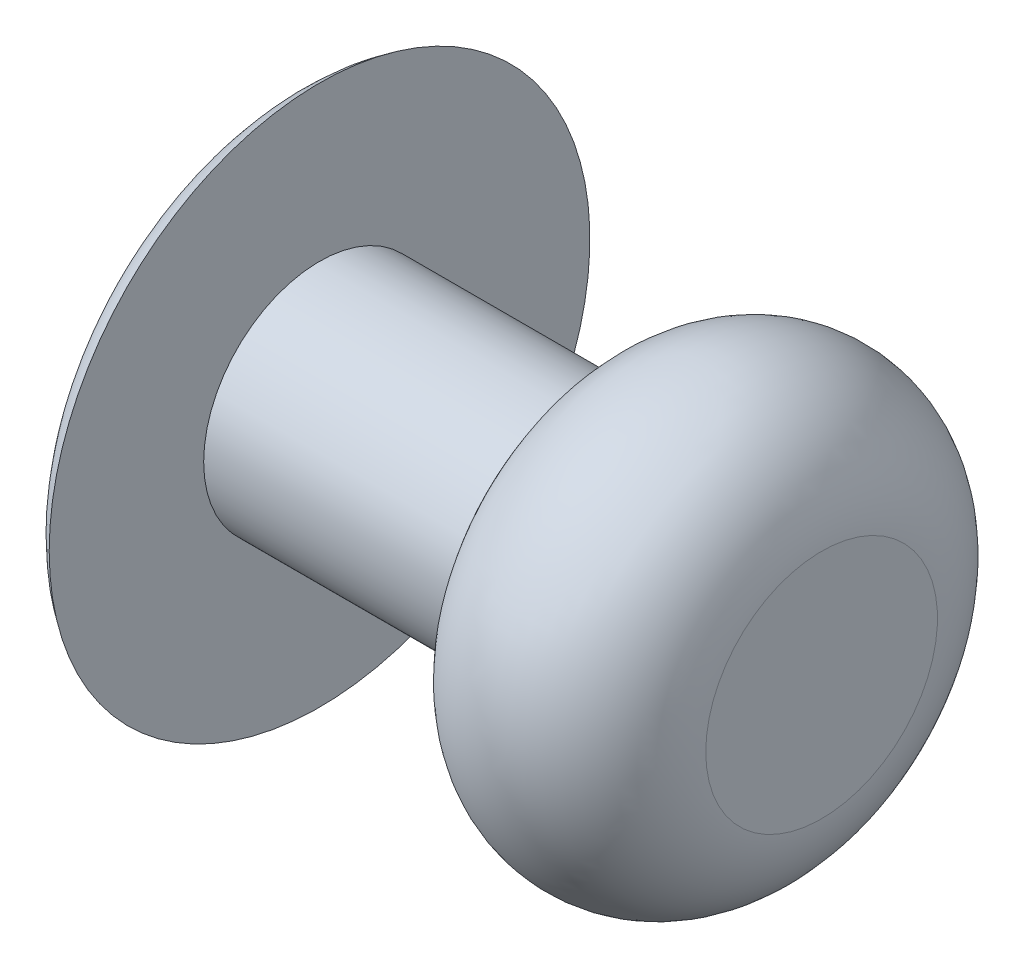
ISO-10303-21;
HEADER;
FILE_DESCRIPTION(('STEP AP214'),'2;1');
FILE_NAME('part.step','',(''),(''),'','','');
FILE_SCHEMA(('AUTOMOTIVE_DESIGN { 1 0 10303 214 1 1 1 1 }'));
ENDSEC;
DATA;
#1=APPLICATION_CONTEXT('core data for automotive mechanical design processes');
#2=APPLICATION_PROTOCOL_DEFINITION('international standard','automotive_design',2000,#1);
#3=PRODUCT_CONTEXT('',#1,'mechanical');
#4=PRODUCT('Part','Part','',(#3));
#5=PRODUCT_RELATED_PRODUCT_CATEGORY('part','',(#4));
#6=PRODUCT_DEFINITION_FORMATION('','',#4);
#7=PRODUCT_DEFINITION_CONTEXT('part definition',#1,'design');
#8=PRODUCT_DEFINITION('design','',#6,#7);
#9=PRODUCT_DEFINITION_SHAPE('','',#8);
#10=(LENGTH_UNIT() NAMED_UNIT(*) SI_UNIT(.MILLI.,.METRE.));
#11=(NAMED_UNIT(*) PLANE_ANGLE_UNIT() SI_UNIT($,.RADIAN.));
#12=(NAMED_UNIT(*) SI_UNIT($,.STERADIAN.) SOLID_ANGLE_UNIT());
#13=UNCERTAINTY_MEASURE_WITH_UNIT(LENGTH_MEASURE(1.E-05),#10,'distance_accuracy_value','');
#14=(GEOMETRIC_REPRESENTATION_CONTEXT(3) GLOBAL_UNCERTAINTY_ASSIGNED_CONTEXT((#13)) GLOBAL_UNIT_ASSIGNED_CONTEXT((#10,
#11,#12)) REPRESENTATION_CONTEXT('',''));
#15=CARTESIAN_POINT('',(0.,0.,0.));
#16=DIRECTION('',(0.,0.,1.));
#17=DIRECTION('',(1.,0.,0.));
#18=AXIS2_PLACEMENT_3D('',#15,#16,#17);
#19=CARTESIAN_POINT('',(-6.43890633447847,1.5,0.));
#20=DIRECTION('',(-1.,0.,0.));
#21=DIRECTION('',(0.,0.,1.));
#22=AXIS2_PLACEMENT_3D('',#19,#20,#21);
#23=PLANE('',#22);
#24=CARTESIAN_POINT('',(-6.43890633447848,0.,0.));
#25=DIRECTION('',(-1.,0.,0.));
#26=DIRECTION('',(0.,0.,1.));
#27=AXIS2_PLACEMENT_3D('',#24,#25,#26);
#28=CIRCLE('',#27,1.5);
#29=CARTESIAN_POINT('',(-6.43890633447848,0.,1.5));
#30=VERTEX_POINT('',#29);
#31=EDGE_CURVE('E10',#30,#30,#28,.T.);
#32=ORIENTED_EDGE('',*,*,#31,.F.);
#33=EDGE_LOOP('',(#32));
#34=FACE_BOUND('',#33,.T.);
#35=ADVANCED_FACE('F30',(#34),#23,.F.);
#36=CARTESIAN_POINT('',(-7.93890633447847,0.,0.));
#37=DIRECTION('',(-1.,0.,0.));
#38=DIRECTION('',(0.,0.,1.));
#39=AXIS2_PLACEMENT_3D('',#36,#37,#38);
#40=DEGENERATE_TOROIDAL_SURFACE('',#39,1.4,1.50332963783729,.T.);
#41=CARTESIAN_POINT('',(-9.43890633447847,0.,0.));
#42=DIRECTION('',(-1.,0.,0.));
#43=DIRECTION('',(0.,0.,1.));
#44=AXIS2_PLACEMENT_3D('',#41,#42,#43);
#45=CIRCLE('',#44,1.5);
#46=CARTESIAN_POINT('',(-9.43890633447847,0.,1.5));
#47=VERTEX_POINT('',#46);
#48=EDGE_CURVE('E36',#47,#47,#45,.T.);
#49=ORIENTED_EDGE('',*,*,#48,.F.);
#50=EDGE_LOOP('',(#49));
#51=FACE_BOUND('',#50,.T.);
#52=ORIENTED_EDGE('',*,*,#31,.T.);
#53=EDGE_LOOP('',(#52));
#54=FACE_BOUND('',#53,.T.);
#55=ADVANCED_FACE('F87',(#51,#54),#40,.T.);
#56=CARTESIAN_POINT('',(-91.1065657230587,0.,0.));
#57=DIRECTION('',(-1.,0.,0.));
#58=DIRECTION('',(0.,0.,1.));
#59=AXIS2_PLACEMENT_3D('',#56,#57,#58);
#60=CYLINDRICAL_SURFACE('',#59,1.5);
#61=CARTESIAN_POINT('',(-12.9389063344785,0.,0.));
#62=DIRECTION('',(-1.,0.,0.));
#63=DIRECTION('',(0.,0.,1.));
#64=AXIS2_PLACEMENT_3D('',#61,#62,#63);
#65=CIRCLE('',#64,1.5);
#66=CARTESIAN_POINT('',(-12.9389063344785,0.,1.5));
#67=VERTEX_POINT('',#66);
#68=EDGE_CURVE('E40',#67,#67,#65,.T.);
#69=ORIENTED_EDGE('',*,*,#68,.F.);
#70=EDGE_LOOP('',(#69));
#71=FACE_BOUND('',#70,.T.);
#72=ORIENTED_EDGE('',*,*,#48,.T.);
#73=EDGE_LOOP('',(#72));
#74=FACE_BOUND('',#73,.T.);
#75=ADVANCED_FACE('F82',(#71,#74),#60,.T.);
#76=CARTESIAN_POINT('',(-12.9389063344785,1.5,0.));
#77=DIRECTION('',(-1.,0.,0.));
#78=DIRECTION('',(0.,0.,1.));
#79=AXIS2_PLACEMENT_3D('',#76,#77,#78);
#80=PLANE('',#79);
#81=CARTESIAN_POINT('',(-12.9389063344785,0.,0.));
#82=DIRECTION('',(-1.,0.,0.));
#83=DIRECTION('',(0.,0.,1.));
#84=AXIS2_PLACEMENT_3D('',#81,#82,#83);
#85=CIRCLE('',#84,3.5);
#86=CARTESIAN_POINT('',(-12.9389063344785,0.,3.5));
#87=VERTEX_POINT('',#86);
#88=EDGE_CURVE('E44',#87,#87,#85,.T.);
#89=ORIENTED_EDGE('',*,*,#88,.F.);
#90=EDGE_LOOP('',(#89));
#91=FACE_BOUND('',#90,.T.);
#92=ORIENTED_EDGE('',*,*,#68,.T.);
#93=EDGE_LOOP('',(#92));
#94=FACE_BOUND('',#93,.T.);
#95=ADVANCED_FACE('F76',(#91,#94),#80,.F.);
#96=CARTESIAN_POINT('',(-12.3084517344285,0.,0.));
#97=DIRECTION('',(-1.,0.,0.));
#98=DIRECTION('',(0.,0.,1.));
#99=AXIS2_PLACEMENT_3D('',#96,#97,#98);
#100=TOROIDAL_SURFACE('',#99,2.5,1.18214762306749);
#101=CARTESIAN_POINT('',(-13.490599357496,0.,0.));
#102=DIRECTION('',(-1.,0.,0.));
#103=DIRECTION('',(0.,0.,1.));
#104=AXIS2_PLACEMENT_3D('',#101,#102,#103);
#105=CIRCLE('',#104,2.5);
#106=CARTESIAN_POINT('',(-13.490599357496,0.,2.5));
#107=VERTEX_POINT('',#106);
#108=EDGE_CURVE('E49',#107,#107,#105,.T.);
#109=ORIENTED_EDGE('',*,*,#108,.F.);
#110=EDGE_LOOP('',(#109));
#111=FACE_BOUND('',#110,.T.);
#112=ORIENTED_EDGE('',*,*,#88,.T.);
#113=EDGE_LOOP('',(#112));
#114=FACE_BOUND('',#113,.T.);
#115=ADVANCED_FACE('F70',(#111,#114),#100,.T.);
#116=CARTESIAN_POINT('',(-13.490599357496,0.,0.));
#117=DIRECTION('',(1.,0.,0.));
#118=DIRECTION('',(0.,0.,-1.));
#119=AXIS2_PLACEMENT_3D('',#116,#117,#118);
#120=PLANE('',#119);
#121=CARTESIAN_POINT('',(-13.490599357496,0.,0.));
#122=DIRECTION('',(-1.,0.,0.));
#123=DIRECTION('',(0.,0.,1.));
#124=AXIS2_PLACEMENT_3D('',#121,#122,#123);
#125=CIRCLE('',#124,1.);
#126=CARTESIAN_POINT('',(-13.490599357496,0.,1.));
#127=VERTEX_POINT('',#126);
#128=EDGE_CURVE('E53',#127,#127,#125,.T.);
#129=ORIENTED_EDGE('',*,*,#128,.F.);
#130=EDGE_LOOP('',(#129));
#131=FACE_BOUND('',#130,.T.);
#132=ORIENTED_EDGE('',*,*,#108,.T.);
#133=EDGE_LOOP('',(#132));
#134=FACE_BOUND('',#133,.T.);
#135=ADVANCED_FACE('F64',(#131,#134),#120,.F.);
#136=CARTESIAN_POINT('',(-9.49059935749604,0.,0.));
#137=DIRECTION('',(-1.,0.,0.));
#138=DIRECTION('',(0.,0.,1.));
#139=AXIS2_PLACEMENT_3D('',#136,#137,#138);
#140=CYLINDRICAL_SURFACE('',#139,1.);
#141=CARTESIAN_POINT('',(-9.49059935749604,0.,0.));
#142=DIRECTION('',(-1.,0.,0.));
#143=DIRECTION('',(0.,0.,1.));
#144=AXIS2_PLACEMENT_3D('',#141,#142,#143);
#145=CIRCLE('',#144,1.);
#146=CARTESIAN_POINT('',(-9.49059935749604,0.,1.));
#147=VERTEX_POINT('',#146);
#148=EDGE_CURVE('E52',#147,#147,#145,.T.);
#149=ORIENTED_EDGE('',*,*,#148,.F.);
#150=EDGE_LOOP('',(#149));
#151=FACE_BOUND('',#150,.T.);
#152=ORIENTED_EDGE('',*,*,#128,.T.);
#153=EDGE_LOOP('',(#152));
#154=FACE_BOUND('',#153,.T.);
#155=ADVANCED_FACE('F61',(#151,#154),#140,.F.);
#156=CARTESIAN_POINT('',(-9.49059935749604,0.,0.));
#157=DIRECTION('',(-1.,0.,0.));
#158=DIRECTION('',(0.,0.,1.));
#159=AXIS2_PLACEMENT_3D('',#156,#157,#158);
#160=PLANE('',#159);
#161=ORIENTED_EDGE('',*,*,#148,.T.);
#162=EDGE_LOOP('',(#161));
#163=FACE_BOUND('',#162,.T.);
#164=ADVANCED_FACE('F59',(#163),#160,.T.);
#165=CLOSED_SHELL('',(#35,#55,#75,#95,#115,#135,#155,#164));
#166=MANIFOLD_SOLID_BREP('B2',#165);
#167=ADVANCED_BREP_SHAPE_REPRESENTATION('',(#18,#166),#14);
#168=SHAPE_DEFINITION_REPRESENTATION(#9,#167);
ENDSEC;
END-ISO-10303-21;
